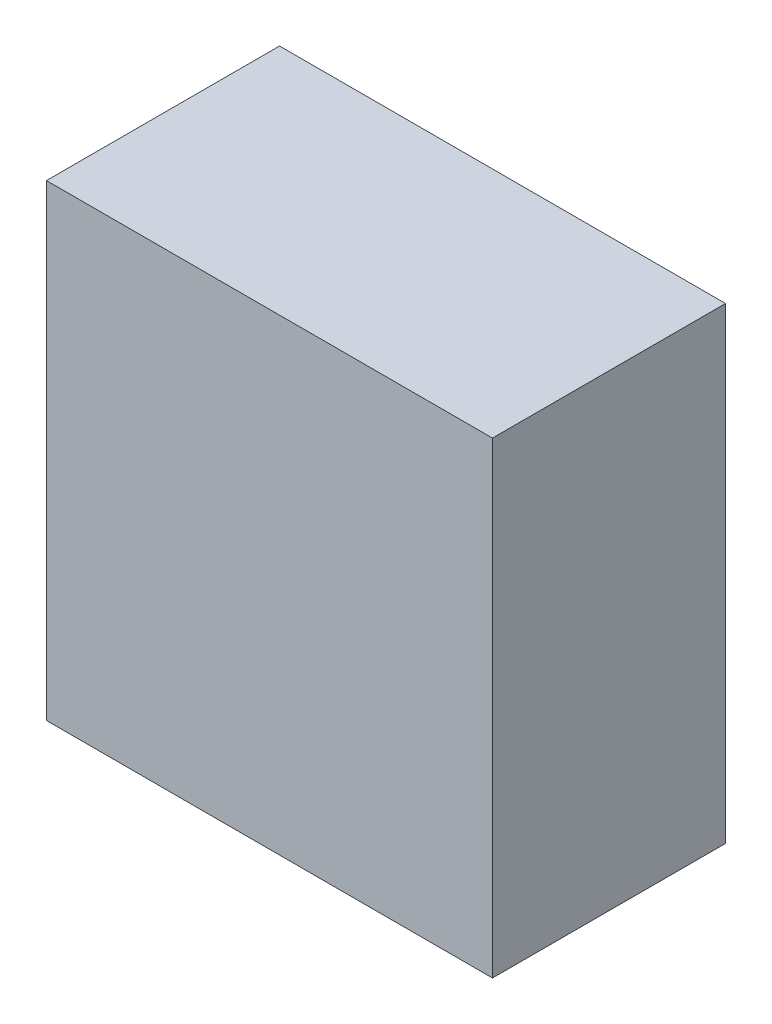
ISO-10303-21;
HEADER;
FILE_DESCRIPTION(('STEP AP214'),'2;1');
FILE_NAME('part.step','',(''),(''),'','','');
FILE_SCHEMA(('AUTOMOTIVE_DESIGN { 1 0 10303 214 1 1 1 1 }'));
ENDSEC;
DATA;
#1=APPLICATION_CONTEXT('core data for automotive mechanical design processes');
#2=APPLICATION_PROTOCOL_DEFINITION('international standard','automotive_design',2000,#1);
#3=PRODUCT_CONTEXT('',#1,'mechanical');
#4=PRODUCT('Part','Part','',(#3));
#5=PRODUCT_RELATED_PRODUCT_CATEGORY('part','',(#4));
#6=PRODUCT_DEFINITION_FORMATION('','',#4);
#7=PRODUCT_DEFINITION_CONTEXT('part definition',#1,'design');
#8=PRODUCT_DEFINITION('design','',#6,#7);
#9=PRODUCT_DEFINITION_SHAPE('','',#8);
#10=(LENGTH_UNIT() NAMED_UNIT(*) SI_UNIT(.MILLI.,.METRE.));
#11=(NAMED_UNIT(*) PLANE_ANGLE_UNIT() SI_UNIT($,.RADIAN.));
#12=(NAMED_UNIT(*) SI_UNIT($,.STERADIAN.) SOLID_ANGLE_UNIT());
#13=UNCERTAINTY_MEASURE_WITH_UNIT(LENGTH_MEASURE(1.E-05),#10,'distance_accuracy_value','');
#14=(GEOMETRIC_REPRESENTATION_CONTEXT(3) GLOBAL_UNCERTAINTY_ASSIGNED_CONTEXT((#13)) GLOBAL_UNIT_ASSIGNED_CONTEXT((#10,
#11,#12)) REPRESENTATION_CONTEXT('',''));
#15=CARTESIAN_POINT('',(0.,0.,0.));
#16=DIRECTION('',(0.,0.,1.));
#17=DIRECTION('',(1.,0.,0.));
#18=AXIS2_PLACEMENT_3D('',#15,#16,#17);
#19=CARTESIAN_POINT('',(-1.55,-1.625,0.));
#20=DIRECTION('',(0.,1.,0.));
#21=DIRECTION('',(1.,0.,0.));
#22=AXIS2_PLACEMENT_3D('',#19,#20,#21);
#23=PLANE('',#22);
#24=DIRECTION('',(1.,0.,0.));
#25=VECTOR('',#24,1.);
#26=CARTESIAN_POINT('',(-1.55,-1.625,0.));
#27=LINE('',#26,#25);
#28=CARTESIAN_POINT('',(-1.55,-1.625,0.));
#29=VERTEX_POINT('',#28);
#30=CARTESIAN_POINT('',(1.55,-1.625,0.));
#31=VERTEX_POINT('',#30);
#32=EDGE_CURVE('E11',#29,#31,#27,.T.);
#33=ORIENTED_EDGE('',*,*,#32,.T.);
#34=DIRECTION('',(0.,0.,1.));
#35=VECTOR('',#34,1.);
#36=CARTESIAN_POINT('',(1.55,-1.625,0.));
#37=LINE('',#36,#35);
#38=CARTESIAN_POINT('',(1.55,-1.625,1.62));
#39=VERTEX_POINT('',#38);
#40=EDGE_CURVE('E23',#31,#39,#37,.T.);
#41=ORIENTED_EDGE('',*,*,#40,.T.);
#42=DIRECTION('',(1.,0.,0.));
#43=VECTOR('',#42,1.);
#44=CARTESIAN_POINT('',(-1.55,-1.625,1.62));
#45=LINE('',#44,#43);
#46=CARTESIAN_POINT('',(-1.55,-1.625,1.62));
#47=VERTEX_POINT('',#46);
#48=EDGE_CURVE('E86',#47,#39,#45,.T.);
#49=ORIENTED_EDGE('',*,*,#48,.F.);
#50=DIRECTION('',(0.,0.,1.));
#51=VECTOR('',#50,1.);
#52=CARTESIAN_POINT('',(-1.55,-1.625,0.));
#53=LINE('',#52,#51);
#54=EDGE_CURVE('E35',#29,#47,#53,.T.);
#55=ORIENTED_EDGE('',*,*,#54,.F.);
#56=EDGE_LOOP('',(#33,#41,#49,#55));
#57=FACE_BOUND('',#56,.T.);
#58=ADVANCED_FACE('F16',(#57),#23,.F.);
#59=CARTESIAN_POINT('',(1.55,-1.625,0.));
#60=DIRECTION('',(-1.,0.,0.));
#61=DIRECTION('',(0.,1.,0.));
#62=AXIS2_PLACEMENT_3D('',#59,#60,#61);
#63=PLANE('',#62);
#64=DIRECTION('',(0.,1.,0.));
#65=VECTOR('',#64,1.);
#66=CARTESIAN_POINT('',(1.55,-1.625,0.));
#67=LINE('',#66,#65);
#68=CARTESIAN_POINT('',(1.55,1.625,0.));
#69=VERTEX_POINT('',#68);
#70=EDGE_CURVE('E83',#31,#69,#67,.T.);
#71=ORIENTED_EDGE('',*,*,#70,.T.);
#72=DIRECTION('',(0.,0.,1.));
#73=VECTOR('',#72,1.);
#74=CARTESIAN_POINT('',(1.55,1.625,0.));
#75=LINE('',#74,#73);
#76=CARTESIAN_POINT('',(1.55,1.625,1.62));
#77=VERTEX_POINT('',#76);
#78=EDGE_CURVE('E81',#69,#77,#75,.T.);
#79=ORIENTED_EDGE('',*,*,#78,.T.);
#80=DIRECTION('',(0.,1.,0.));
#81=VECTOR('',#80,1.);
#82=CARTESIAN_POINT('',(1.55,-1.625,1.62));
#83=LINE('',#82,#81);
#84=EDGE_CURVE('E61',#39,#77,#83,.T.);
#85=ORIENTED_EDGE('',*,*,#84,.F.);
#86=ORIENTED_EDGE('',*,*,#40,.F.);
#87=EDGE_LOOP('',(#71,#79,#85,#86));
#88=FACE_BOUND('',#87,.T.);
#89=ADVANCED_FACE('F88',(#88),#63,.F.);
#90=CARTESIAN_POINT('',(1.55,1.625,0.));
#91=DIRECTION('',(0.,-1.,0.));
#92=DIRECTION('',(-1.,0.,0.));
#93=AXIS2_PLACEMENT_3D('',#90,#91,#92);
#94=PLANE('',#93);
#95=DIRECTION('',(-1.,0.,0.));
#96=VECTOR('',#95,1.);
#97=CARTESIAN_POINT('',(1.55,1.625,0.));
#98=LINE('',#97,#96);
#99=CARTESIAN_POINT('',(-1.55,1.625,0.));
#100=VERTEX_POINT('',#99);
#101=EDGE_CURVE('E70',#69,#100,#98,.T.);
#102=ORIENTED_EDGE('',*,*,#101,.T.);
#103=DIRECTION('',(0.,0.,1.));
#104=VECTOR('',#103,1.);
#105=CARTESIAN_POINT('',(-1.55,1.625,0.));
#106=LINE('',#105,#104);
#107=CARTESIAN_POINT('',(-1.55,1.625,1.62));
#108=VERTEX_POINT('',#107);
#109=EDGE_CURVE('E64',#100,#108,#106,.T.);
#110=ORIENTED_EDGE('',*,*,#109,.T.);
#111=DIRECTION('',(-1.,0.,0.));
#112=VECTOR('',#111,1.);
#113=CARTESIAN_POINT('',(1.55,1.625,1.62));
#114=LINE('',#113,#112);
#115=EDGE_CURVE('E56',#77,#108,#114,.T.);
#116=ORIENTED_EDGE('',*,*,#115,.F.);
#117=ORIENTED_EDGE('',*,*,#78,.F.);
#118=EDGE_LOOP('',(#102,#110,#116,#117));
#119=FACE_BOUND('',#118,.T.);
#120=ADVANCED_FACE('F68',(#119),#94,.F.);
#121=CARTESIAN_POINT('',(-1.55,1.625,0.));
#122=DIRECTION('',(1.,0.,0.));
#123=DIRECTION('',(0.,-1.,0.));
#124=AXIS2_PLACEMENT_3D('',#121,#122,#123);
#125=PLANE('',#124);
#126=DIRECTION('',(0.,-1.,0.));
#127=VECTOR('',#126,1.);
#128=CARTESIAN_POINT('',(-1.55,1.625,0.));
#129=LINE('',#128,#127);
#130=EDGE_CURVE('E65',#100,#29,#129,.T.);
#131=ORIENTED_EDGE('',*,*,#130,.T.);
#132=ORIENTED_EDGE('',*,*,#54,.T.);
#133=DIRECTION('',(0.,-1.,0.));
#134=VECTOR('',#133,1.);
#135=CARTESIAN_POINT('',(-1.55,1.625,1.62));
#136=LINE('',#135,#134);
#137=EDGE_CURVE('E60',#108,#47,#136,.T.);
#138=ORIENTED_EDGE('',*,*,#137,.F.);
#139=ORIENTED_EDGE('',*,*,#109,.F.);
#140=EDGE_LOOP('',(#131,#132,#138,#139));
#141=FACE_BOUND('',#140,.T.);
#142=ADVANCED_FACE('F75',(#141),#125,.F.);
#143=CARTESIAN_POINT('',(0.,0.,0.));
#144=DIRECTION('',(0.,0.,1.));
#145=DIRECTION('',(1.,0.,0.));
#146=AXIS2_PLACEMENT_3D('',#143,#144,#145);
#147=PLANE('',#146);
#148=ORIENTED_EDGE('',*,*,#130,.F.);
#149=ORIENTED_EDGE('',*,*,#101,.F.);
#150=ORIENTED_EDGE('',*,*,#70,.F.);
#151=ORIENTED_EDGE('',*,*,#32,.F.);
#152=EDGE_LOOP('',(#148,#149,#150,#151));
#153=FACE_BOUND('',#152,.T.);
#154=ADVANCED_FACE('F90',(#153),#147,.F.);
#155=CARTESIAN_POINT('',(0.,0.,1.62));
#156=DIRECTION('',(0.,0.,1.));
#157=DIRECTION('',(1.,0.,0.));
#158=AXIS2_PLACEMENT_3D('',#155,#156,#157);
#159=PLANE('',#158);
#160=ORIENTED_EDGE('',*,*,#48,.T.);
#161=ORIENTED_EDGE('',*,*,#84,.T.);
#162=ORIENTED_EDGE('',*,*,#115,.T.);
#163=ORIENTED_EDGE('',*,*,#137,.T.);
#164=EDGE_LOOP('',(#160,#161,#162,#163));
#165=FACE_BOUND('',#164,.T.);
#166=ADVANCED_FACE('F58',(#165),#159,.T.);
#167=CLOSED_SHELL('',(#58,#89,#120,#142,#154,#166));
#168=MANIFOLD_SOLID_BREP('B1',#167);
#169=ADVANCED_BREP_SHAPE_REPRESENTATION('',(#18,#168),#14);
#170=SHAPE_DEFINITION_REPRESENTATION(#9,#169);
ENDSEC;
END-ISO-10303-21;
